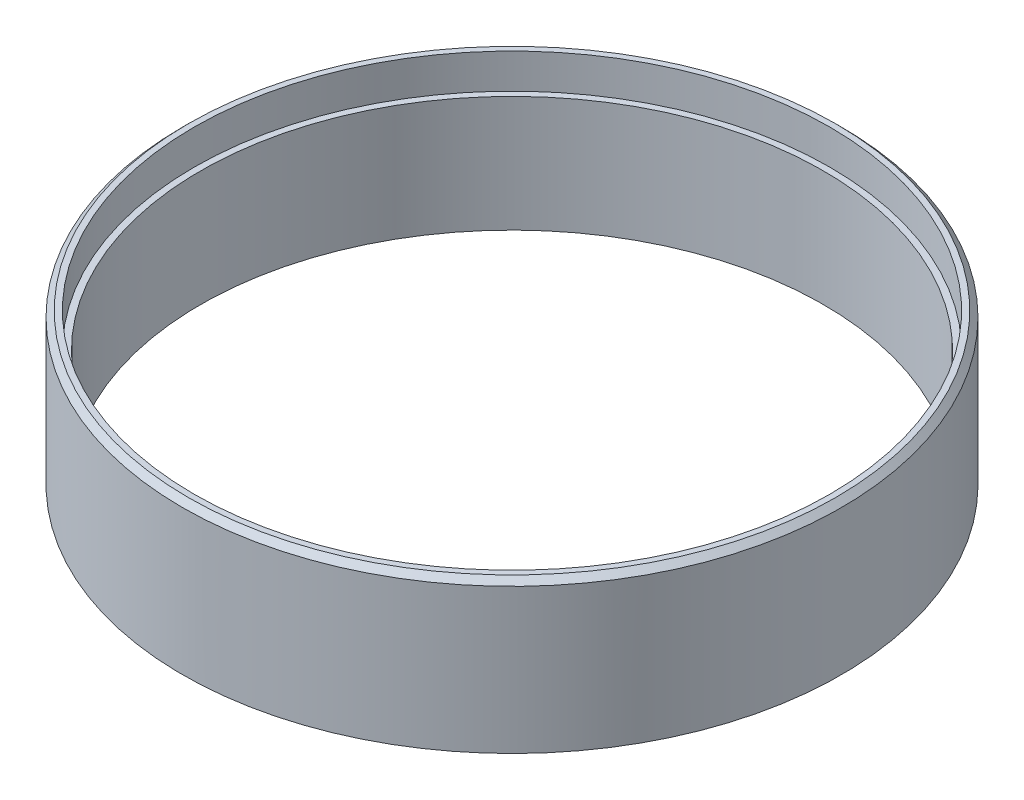
ISO-10303-21;
HEADER;
FILE_DESCRIPTION(('STEP AP214'),'2;1');
FILE_NAME('part.step','',(''),(''),'','','');
FILE_SCHEMA(('AUTOMOTIVE_DESIGN { 1 0 10303 214 1 1 1 1 }'));
ENDSEC;
DATA;
#1=APPLICATION_CONTEXT('core data for automotive mechanical design processes');
#2=APPLICATION_PROTOCOL_DEFINITION('international standard','automotive_design',2000,#1);
#3=PRODUCT_CONTEXT('',#1,'mechanical');
#4=PRODUCT('Part','Part','',(#3));
#5=PRODUCT_RELATED_PRODUCT_CATEGORY('part','',(#4));
#6=PRODUCT_DEFINITION_FORMATION('','',#4);
#7=PRODUCT_DEFINITION_CONTEXT('part definition',#1,'design');
#8=PRODUCT_DEFINITION('design','',#6,#7);
#9=PRODUCT_DEFINITION_SHAPE('','',#8);
#10=(LENGTH_UNIT() NAMED_UNIT(*) SI_UNIT(.MILLI.,.METRE.));
#11=(NAMED_UNIT(*) PLANE_ANGLE_UNIT() SI_UNIT($,.RADIAN.));
#12=(NAMED_UNIT(*) SI_UNIT($,.STERADIAN.) SOLID_ANGLE_UNIT());
#13=UNCERTAINTY_MEASURE_WITH_UNIT(LENGTH_MEASURE(1.E-05),#10,'distance_accuracy_value','');
#14=(GEOMETRIC_REPRESENTATION_CONTEXT(3) GLOBAL_UNCERTAINTY_ASSIGNED_CONTEXT((#13)) GLOBAL_UNIT_ASSIGNED_CONTEXT((#10,
#11,#12)) REPRESENTATION_CONTEXT('',''));
#15=CARTESIAN_POINT('',(0.,0.,0.));
#16=DIRECTION('',(0.,0.,1.));
#17=DIRECTION('',(1.,0.,0.));
#18=AXIS2_PLACEMENT_3D('',#15,#16,#17);
#19=CARTESIAN_POINT('',(0.,-0.65,0.));
#20=DIRECTION('',(0.,1.,0.));
#21=DIRECTION('',(1.,0.,0.));
#22=AXIS2_PLACEMENT_3D('',#19,#20,#21);
#23=CYLINDRICAL_SURFACE('',#22,28.45);
#24=CARTESIAN_POINT('',(0.,12.5,0.));
#25=DIRECTION('',(0.,1.,0.));
#26=DIRECTION('',(1.,0.,0.));
#27=AXIS2_PLACEMENT_3D('',#24,#25,#26);
#28=CIRCLE('',#27,28.45);
#29=CARTESIAN_POINT('',(-28.45,12.5,0.));
#30=VERTEX_POINT('',#29);
#31=CARTESIAN_POINT('',(0.,12.5,28.45));
#32=VERTEX_POINT('',#31);
#33=EDGE_CURVE('E97',#30,#32,#28,.T.);
#34=ORIENTED_EDGE('',*,*,#33,.F.);
#35=DIRECTION('',(0.,-1.,0.));
#36=VECTOR('',#35,1.);
#37=CARTESIAN_POINT('',(-28.45,-0.65,0.));
#38=LINE('',#37,#36);
#39=CARTESIAN_POINT('',(-28.45,0.,0.));
#40=VERTEX_POINT('',#39);
#41=EDGE_CURVE('E11',#30,#40,#38,.T.);
#42=ORIENTED_EDGE('',*,*,#41,.T.);
#43=CARTESIAN_POINT('',(0.,0.,0.));
#44=DIRECTION('',(0.,-1.,0.));
#45=DIRECTION('',(1.,0.,0.));
#46=AXIS2_PLACEMENT_3D('',#43,#44,#45);
#47=CIRCLE('',#46,28.45);
#48=EDGE_CURVE('E82',#40,#40,#47,.T.);
#49=ORIENTED_EDGE('',*,*,#48,.F.);
#50=ORIENTED_EDGE('',*,*,#41,.F.);
#51=CARTESIAN_POINT('',(0.,12.5,0.));
#52=DIRECTION('',(0.,1.,0.));
#53=DIRECTION('',(1.,0.,0.));
#54=AXIS2_PLACEMENT_3D('',#51,#52,#53);
#55=CIRCLE('',#54,28.45);
#56=EDGE_CURVE('E28',#32,#30,#55,.T.);
#57=ORIENTED_EDGE('',*,*,#56,.F.);
#58=EDGE_LOOP('',(#34,#42,#49,#50,#57));
#59=FACE_BOUND('',#58,.T.);
#60=ADVANCED_FACE('F17',(#59),#23,.T.);
#61=CARTESIAN_POINT('',(0.,12.75000000009,-1.583674316397E-13));
#62=DIRECTION('',(0.,-1.,0.));
#63=DIRECTION('',(0.,0.,-1.));
#64=AXIS2_PLACEMENT_3D('',#61,#62,#63);
#65=CONICAL_SURFACE('',#64,28.19999999991,0.785398163397448);
#66=ORIENTED_EDGE('',*,*,#33,.T.);
#67=DIRECTION('',(0.,0.707106781186548,-0.707106781186548));
#68=VECTOR('',#67,1.);
#69=CARTESIAN_POINT('',(0.,12.75000000009,28.1999999999098));
#70=LINE('',#69,#68);
#71=CARTESIAN_POINT('',(0.,13.,27.95));
#72=VERTEX_POINT('',#71);
#73=EDGE_CURVE('E95',#32,#72,#70,.T.);
#74=ORIENTED_EDGE('',*,*,#73,.T.);
#75=CARTESIAN_POINT('',(0.,13.,-1.583674316397E-13));
#76=DIRECTION('',(0.,1.,0.));
#77=DIRECTION('',(1.,0.,0.));
#78=AXIS2_PLACEMENT_3D('',#75,#76,#77);
#79=CIRCLE('',#78,27.95);
#80=EDGE_CURVE('E21',#72,#72,#79,.T.);
#81=ORIENTED_EDGE('',*,*,#80,.F.);
#82=ORIENTED_EDGE('',*,*,#73,.F.);
#83=ORIENTED_EDGE('',*,*,#56,.T.);
#84=EDGE_LOOP('',(#66,#74,#81,#82,#83));
#85=FACE_BOUND('',#84,.T.);
#86=ADVANCED_FACE('F173',(#85),#65,.T.);
#87=CARTESIAN_POINT('',(0.,13.,0.));
#88=DIRECTION('',(0.,1.,0.));
#89=DIRECTION('',(1.,0.,0.));
#90=AXIS2_PLACEMENT_3D('',#87,#88,#89);
#91=PLANE('',#90);
#92=CARTESIAN_POINT('',(0.,13.,0.));
#93=DIRECTION('',(0.,1.,0.));
#94=DIRECTION('',(1.,0.,0.));
#95=AXIS2_PLACEMENT_3D('',#92,#93,#94);
#96=CIRCLE('',#95,27.45);
#97=CARTESIAN_POINT('',(-27.45,13.,0.));
#98=VERTEX_POINT('',#97);
#99=EDGE_CURVE('E109',#98,#98,#96,.T.);
#100=ORIENTED_EDGE('',*,*,#99,.F.);
#101=EDGE_LOOP('',(#100));
#102=FACE_BOUND('',#101,.T.);
#103=ORIENTED_EDGE('',*,*,#80,.T.);
#104=EDGE_LOOP('',(#103));
#105=FACE_BOUND('',#104,.T.);
#106=ADVANCED_FACE('F19',(#102,#105),#91,.T.);
#107=CARTESIAN_POINT('',(0.,-0.65,0.));
#108=DIRECTION('',(0.,1.,0.));
#109=DIRECTION('',(1.,0.,0.));
#110=AXIS2_PLACEMENT_3D('',#107,#108,#109);
#111=CYLINDRICAL_SURFACE('',#110,27.45);
#112=CARTESIAN_POINT('',(0.,10.,0.));
#113=DIRECTION('',(0.,1.,0.));
#114=DIRECTION('',(1.,0.,0.));
#115=AXIS2_PLACEMENT_3D('',#112,#113,#114);
#116=CIRCLE('',#115,27.45);
#117=CARTESIAN_POINT('',(-27.45,10.,0.));
#118=VERTEX_POINT('',#117);
#119=EDGE_CURVE('E76',#118,#118,#116,.T.);
#120=ORIENTED_EDGE('',*,*,#119,.F.);
#121=DIRECTION('',(0.,1.,0.));
#122=VECTOR('',#121,1.);
#123=CARTESIAN_POINT('',(-27.45,-0.65,0.));
#124=LINE('',#123,#122);
#125=EDGE_CURVE('E93',#118,#98,#124,.T.);
#126=ORIENTED_EDGE('',*,*,#125,.T.);
#127=ORIENTED_EDGE('',*,*,#99,.T.);
#128=ORIENTED_EDGE('',*,*,#125,.F.);
#129=EDGE_LOOP('',(#120,#126,#127,#128));
#130=FACE_BOUND('',#129,.T.);
#131=ADVANCED_FACE('F125',(#130),#111,.F.);
#132=CARTESIAN_POINT('',(0.,10.,0.));
#133=DIRECTION('',(0.,-1.,0.));
#134=DIRECTION('',(0.,0.,-1.));
#135=AXIS2_PLACEMENT_3D('',#132,#133,#134);
#136=PLANE('',#135);
#137=CARTESIAN_POINT('',(0.,10.,0.));
#138=DIRECTION('',(0.,1.,0.));
#139=DIRECTION('',(-1.,0.,0.));
#140=AXIS2_PLACEMENT_3D('',#137,#138,#139);
#141=CIRCLE('',#140,26.9);
#142=CARTESIAN_POINT('',(26.9,10.,0.));
#143=VERTEX_POINT('',#142);
#144=EDGE_CURVE('E74',#143,#143,#141,.T.);
#145=ORIENTED_EDGE('',*,*,#144,.F.);
#146=EDGE_LOOP('',(#145));
#147=FACE_BOUND('',#146,.T.);
#148=ORIENTED_EDGE('',*,*,#119,.T.);
#149=EDGE_LOOP('',(#148));
#150=FACE_BOUND('',#149,.T.);
#151=ADVANCED_FACE('F183',(#147,#150),#136,.F.);
#152=CARTESIAN_POINT('',(0.,10.,0.));
#153=DIRECTION('',(0.,-1.,0.));
#154=DIRECTION('',(-1.,0.,0.));
#155=AXIS2_PLACEMENT_3D('',#152,#153,#154);
#156=CYLINDRICAL_SURFACE('',#155,26.9);
#157=ORIENTED_EDGE('',*,*,#144,.T.);
#158=DIRECTION('',(0.,-1.,0.));
#159=VECTOR('',#158,1.);
#160=CARTESIAN_POINT('',(26.9,10.,0.));
#161=LINE('',#160,#159);
#162=CARTESIAN_POINT('',(26.9,0.,0.));
#163=VERTEX_POINT('',#162);
#164=EDGE_CURVE('E69',#143,#163,#161,.T.);
#165=ORIENTED_EDGE('',*,*,#164,.T.);
#166=CARTESIAN_POINT('',(0.,0.,0.));
#167=DIRECTION('',(0.,1.,0.));
#168=DIRECTION('',(-1.,0.,0.));
#169=AXIS2_PLACEMENT_3D('',#166,#167,#168);
#170=CIRCLE('',#169,26.9);
#171=EDGE_CURVE('E72',#163,#163,#170,.T.);
#172=ORIENTED_EDGE('',*,*,#171,.F.);
#173=ORIENTED_EDGE('',*,*,#164,.F.);
#174=EDGE_LOOP('',(#157,#165,#172,#173));
#175=FACE_BOUND('',#174,.T.);
#176=ADVANCED_FACE('F71',(#175),#156,.F.);
#177=CARTESIAN_POINT('',(0.,0.,0.));
#178=DIRECTION('',(0.,1.,0.));
#179=DIRECTION('',(1.,0.,0.));
#180=AXIS2_PLACEMENT_3D('',#177,#178,#179);
#181=PLANE('',#180);
#182=ORIENTED_EDGE('',*,*,#171,.T.);
#183=EDGE_LOOP('',(#182));
#184=FACE_BOUND('',#183,.T.);
#185=ORIENTED_EDGE('',*,*,#48,.T.);
#186=EDGE_LOOP('',(#185));
#187=FACE_BOUND('',#186,.T.);
#188=ADVANCED_FACE('F79',(#184,#187),#181,.F.);
#189=CLOSED_SHELL('',(#60,#86,#106,#131,#151,#176,#188));
#190=MANIFOLD_SOLID_BREP('B1',#189);
#191=ADVANCED_BREP_SHAPE_REPRESENTATION('',(#18,#190),#14);
#192=SHAPE_DEFINITION_REPRESENTATION(#9,#191);
ENDSEC;
END-ISO-10303-21;
